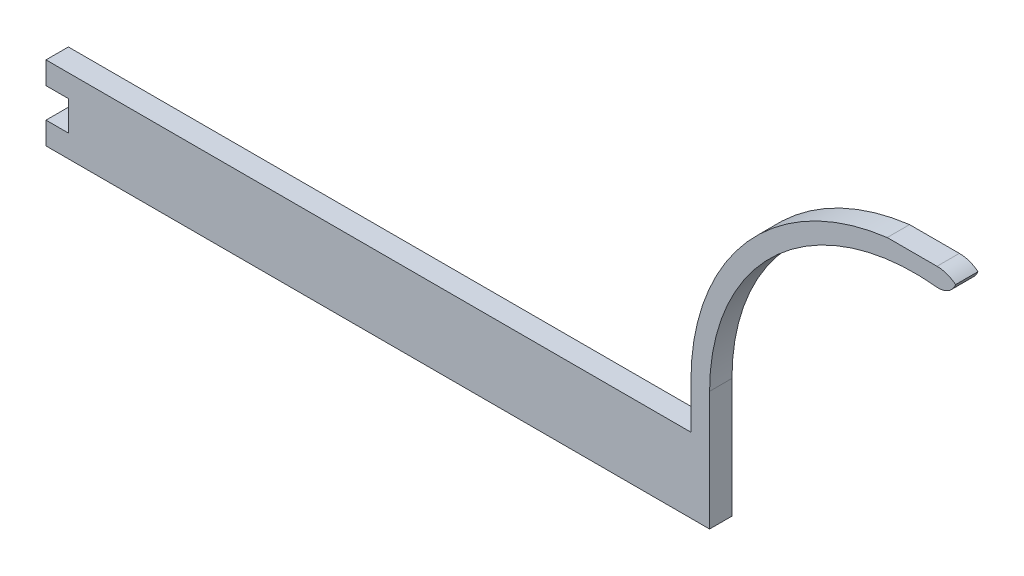
ISO-10303-21;
HEADER;
FILE_DESCRIPTION(('STEP AP214'),'2;1');
FILE_NAME('part.step','',(''),(''),'','','');
FILE_SCHEMA(('AUTOMOTIVE_DESIGN { 1 0 10303 214 1 1 1 1 }'));
ENDSEC;
DATA;
#1=APPLICATION_CONTEXT('core data for automotive mechanical design processes');
#2=APPLICATION_PROTOCOL_DEFINITION('international standard','automotive_design',2000,#1);
#3=PRODUCT_CONTEXT('',#1,'mechanical');
#4=PRODUCT('Part','Part','',(#3));
#5=PRODUCT_RELATED_PRODUCT_CATEGORY('part','',(#4));
#6=PRODUCT_DEFINITION_FORMATION('','',#4);
#7=PRODUCT_DEFINITION_CONTEXT('part definition',#1,'design');
#8=PRODUCT_DEFINITION('design','',#6,#7);
#9=PRODUCT_DEFINITION_SHAPE('','',#8);
#10=(LENGTH_UNIT() NAMED_UNIT(*) SI_UNIT(.MILLI.,.METRE.));
#11=(NAMED_UNIT(*) PLANE_ANGLE_UNIT() SI_UNIT($,.RADIAN.));
#12=(NAMED_UNIT(*) SI_UNIT($,.STERADIAN.) SOLID_ANGLE_UNIT());
#13=UNCERTAINTY_MEASURE_WITH_UNIT(LENGTH_MEASURE(1.E-05),#10,'distance_accuracy_value','');
#14=(GEOMETRIC_REPRESENTATION_CONTEXT(3) GLOBAL_UNCERTAINTY_ASSIGNED_CONTEXT((#13)) GLOBAL_UNIT_ASSIGNED_CONTEXT((#10,
#11,#12)) REPRESENTATION_CONTEXT('',''));
#15=CARTESIAN_POINT('',(0.,0.,0.));
#16=DIRECTION('',(0.,0.,1.));
#17=DIRECTION('',(1.,0.,0.));
#18=AXIS2_PLACEMENT_3D('',#15,#16,#17);
#19=CARTESIAN_POINT('',(172.,0.,6.));
#20=DIRECTION('',(-1.,0.,0.));
#21=DIRECTION('',(0.,0.,1.));
#22=AXIS2_PLACEMENT_3D('',#19,#20,#21);
#23=PLANE('',#22);
#24=DIRECTION('',(0.,1.,0.));
#25=VECTOR('',#24,1.);
#26=CARTESIAN_POINT('',(172.,0.,0.));
#27=LINE('',#26,#25);
#28=CARTESIAN_POINT('',(172.,0.,0.));
#29=VERTEX_POINT('',#28);
#30=CARTESIAN_POINT('',(172.,32.,0.));
#31=VERTEX_POINT('',#30);
#32=EDGE_CURVE('E180',#29,#31,#27,.T.);
#33=ORIENTED_EDGE('',*,*,#32,.T.);
#34=DIRECTION('',(0.,0.,-1.));
#35=VECTOR('',#34,1.);
#36=CARTESIAN_POINT('',(172.,32.,6.));
#37=LINE('',#36,#35);
#38=CARTESIAN_POINT('',(172.,32.,6.));
#39=VERTEX_POINT('',#38);
#40=EDGE_CURVE('E48',#39,#31,#37,.T.);
#41=ORIENTED_EDGE('',*,*,#40,.F.);
#42=DIRECTION('',(0.,1.,0.));
#43=VECTOR('',#42,1.);
#44=CARTESIAN_POINT('',(172.,0.,6.));
#45=LINE('',#44,#43);
#46=CARTESIAN_POINT('',(172.,0.,6.));
#47=VERTEX_POINT('',#46);
#48=EDGE_CURVE('E118',#47,#39,#45,.T.);
#49=ORIENTED_EDGE('',*,*,#48,.F.);
#50=DIRECTION('',(0.,0.,-1.));
#51=VECTOR('',#50,1.);
#52=CARTESIAN_POINT('',(172.,0.,6.));
#53=LINE('',#52,#51);
#54=EDGE_CURVE('E11',#47,#29,#53,.T.);
#55=ORIENTED_EDGE('',*,*,#54,.T.);
#56=EDGE_LOOP('',(#33,#41,#49,#55));
#57=FACE_BOUND('',#56,.T.);
#58=ADVANCED_FACE('F39',(#57),#23,.F.);
#59=CARTESIAN_POINT('',(227.,32.,6.));
#60=DIRECTION('',(0.,0.,-1.));
#61=DIRECTION('',(-1.,0.,0.));
#62=AXIS2_PLACEMENT_3D('',#59,#60,#61);
#63=CYLINDRICAL_SURFACE('',#62,55.);
#64=CARTESIAN_POINT('',(227.,32.,0.));
#65=DIRECTION('',(0.,0.,-1.));
#66=DIRECTION('',(1.,0.,0.));
#67=AXIS2_PLACEMENT_3D('',#64,#65,#66);
#68=CIRCLE('',#67,55.);
#69=CARTESIAN_POINT('',(232.906213145296,86.681959056734,0.));
#70=VERTEX_POINT('',#69);
#71=EDGE_CURVE('E183',#31,#70,#68,.T.);
#72=ORIENTED_EDGE('',*,*,#71,.T.);
#73=DIRECTION('',(0.,0.,-1.));
#74=VECTOR('',#73,1.);
#75=CARTESIAN_POINT('',(232.906213145296,86.681959056734,6.));
#76=LINE('',#75,#74);
#77=CARTESIAN_POINT('',(232.906213145296,86.681959056734,6.));
#78=VERTEX_POINT('',#77);
#79=EDGE_CURVE('E254',#78,#70,#76,.T.);
#80=ORIENTED_EDGE('',*,*,#79,.F.);
#81=CARTESIAN_POINT('',(227.,32.,6.));
#82=DIRECTION('',(0.,0.,-1.));
#83=DIRECTION('',(1.,0.,0.));
#84=AXIS2_PLACEMENT_3D('',#81,#82,#83);
#85=CIRCLE('',#84,55.);
#86=EDGE_CURVE('E264',#39,#78,#85,.T.);
#87=ORIENTED_EDGE('',*,*,#86,.F.);
#88=ORIENTED_EDGE('',*,*,#40,.T.);
#89=EDGE_LOOP('',(#72,#80,#87,#88));
#90=FACE_BOUND('',#89,.T.);
#91=ADVANCED_FACE('F262',(#90),#63,.F.);
#92=CARTESIAN_POINT('',(233.431735039773,91.5474398665704,6.));
#93=DIRECTION('',(0.,0.,-1.));
#94=DIRECTION('',(-1.,0.,0.));
#95=AXIS2_PLACEMENT_3D('',#92,#93,#94);
#96=CYLINDRICAL_SURFACE('',#95,4.89377939556547);
#97=CARTESIAN_POINT('',(233.431735039773,91.5474398665704,0.));
#98=DIRECTION('',(0.,0.,1.));
#99=DIRECTION('',(1.,0.,0.));
#100=AXIS2_PLACEMENT_3D('',#97,#98,#99);
#101=CIRCLE('',#100,4.89377939556547);
#102=CARTESIAN_POINT('',(238.,89.7924378649688,0.));
#103=VERTEX_POINT('',#102);
#104=EDGE_CURVE('E186',#70,#103,#101,.T.);
#105=ORIENTED_EDGE('',*,*,#104,.T.);
#106=DIRECTION('',(0.,0.,-1.));
#107=VECTOR('',#106,1.);
#108=CARTESIAN_POINT('',(238.,89.7924378649688,6.));
#109=LINE('',#108,#107);
#110=CARTESIAN_POINT('',(238.,89.7924378649688,6.));
#111=VERTEX_POINT('',#110);
#112=EDGE_CURVE('E250',#111,#103,#109,.T.);
#113=ORIENTED_EDGE('',*,*,#112,.F.);
#114=CARTESIAN_POINT('',(233.431735039773,91.5474398665704,6.));
#115=DIRECTION('',(0.,0.,1.));
#116=DIRECTION('',(1.,0.,0.));
#117=AXIS2_PLACEMENT_3D('',#114,#115,#116);
#118=CIRCLE('',#117,4.89377939556547);
#119=EDGE_CURVE('E284',#78,#111,#118,.T.);
#120=ORIENTED_EDGE('',*,*,#119,.F.);
#121=ORIENTED_EDGE('',*,*,#79,.T.);
#122=EDGE_LOOP('',(#105,#113,#120,#121));
#123=FACE_BOUND('',#122,.T.);
#124=ADVANCED_FACE('F274',(#123),#96,.T.);
#125=CARTESIAN_POINT('',(233.,83.5474398665704,6.));
#126=DIRECTION('',(0.,0.,-1.));
#127=DIRECTION('',(-1.,0.,0.));
#128=AXIS2_PLACEMENT_3D('',#125,#126,#127);
#129=CYLINDRICAL_SURFACE('',#128,8.00000000000002);
#130=CARTESIAN_POINT('',(233.,83.5474398665704,0.));
#131=DIRECTION('',(0.,0.,1.));
#132=DIRECTION('',(1.,0.,0.));
#133=AXIS2_PLACEMENT_3D('',#130,#131,#132);
#134=CIRCLE('',#133,8.00000000000002);
#135=CARTESIAN_POINT('',(233.,91.5474398665704,0.));
#136=VERTEX_POINT('',#135);
#137=EDGE_CURVE('E189',#103,#136,#134,.T.);
#138=ORIENTED_EDGE('',*,*,#137,.T.);
#139=DIRECTION('',(0.,0.,-1.));
#140=VECTOR('',#139,1.);
#141=CARTESIAN_POINT('',(233.,91.5474398665704,6.));
#142=LINE('',#141,#140);
#143=CARTESIAN_POINT('',(233.,91.5474398665704,6.));
#144=VERTEX_POINT('',#143);
#145=EDGE_CURVE('E246',#144,#136,#142,.T.);
#146=ORIENTED_EDGE('',*,*,#145,.F.);
#147=CARTESIAN_POINT('',(233.,83.5474398665704,6.));
#148=DIRECTION('',(0.,0.,1.));
#149=DIRECTION('',(1.,0.,0.));
#150=AXIS2_PLACEMENT_3D('',#147,#148,#149);
#151=CIRCLE('',#150,8.00000000000002);
#152=EDGE_CURVE('E280',#111,#144,#151,.T.);
#153=ORIENTED_EDGE('',*,*,#152,.F.);
#154=ORIENTED_EDGE('',*,*,#112,.T.);
#155=EDGE_LOOP('',(#138,#146,#153,#154));
#156=FACE_BOUND('',#155,.T.);
#157=ADVANCED_FACE('F278',(#156),#129,.T.);
#158=CARTESIAN_POINT('',(233.,91.5474398665704,6.));
#159=DIRECTION('',(0.,-1.,0.));
#160=DIRECTION('',(0.,0.,-1.));
#161=AXIS2_PLACEMENT_3D('',#158,#159,#160);
#162=PLANE('',#161);
#163=DIRECTION('',(-1.,0.,0.));
#164=VECTOR('',#163,1.);
#165=CARTESIAN_POINT('',(233.,91.5474398665704,0.));
#166=LINE('',#165,#164);
#167=CARTESIAN_POINT('',(219.644566271308,91.5474398665704,0.));
#168=VERTEX_POINT('',#167);
#169=EDGE_CURVE('E192',#136,#168,#166,.T.);
#170=ORIENTED_EDGE('',*,*,#169,.T.);
#171=DIRECTION('',(0.,0.,-1.));
#172=VECTOR('',#171,1.);
#173=CARTESIAN_POINT('',(219.644566271308,91.5474398665704,6.));
#174=LINE('',#173,#172);
#175=CARTESIAN_POINT('',(219.644566271308,91.5474398665704,6.));
#176=VERTEX_POINT('',#175);
#177=EDGE_CURVE('E242',#176,#168,#174,.T.);
#178=ORIENTED_EDGE('',*,*,#177,.F.);
#179=DIRECTION('',(-1.,0.,0.));
#180=VECTOR('',#179,1.);
#181=CARTESIAN_POINT('',(233.,91.5474398665704,6.));
#182=LINE('',#181,#180);
#183=EDGE_CURVE('E283',#144,#176,#182,.T.);
#184=ORIENTED_EDGE('',*,*,#183,.F.);
#185=ORIENTED_EDGE('',*,*,#145,.T.);
#186=EDGE_LOOP('',(#170,#178,#184,#185));
#187=FACE_BOUND('',#186,.T.);
#188=ADVANCED_FACE('F340',(#187),#162,.F.);
#189=CARTESIAN_POINT('',(227.,32.,6.));
#190=DIRECTION('',(0.,0.,-1.));
#191=DIRECTION('',(-1.,0.,0.));
#192=AXIS2_PLACEMENT_3D('',#189,#190,#191);
#193=CYLINDRICAL_SURFACE('',#192,60.);
#194=CARTESIAN_POINT('',(227.,32.,0.));
#195=DIRECTION('',(0.,0.,1.));
#196=DIRECTION('',(1.,0.,0.));
#197=AXIS2_PLACEMENT_3D('',#194,#195,#196);
#198=CIRCLE('',#197,60.);
#199=CARTESIAN_POINT('',(167.,32.,0.));
#200=VERTEX_POINT('',#199);
#201=EDGE_CURVE('E195',#168,#200,#198,.T.);
#202=ORIENTED_EDGE('',*,*,#201,.T.);
#203=DIRECTION('',(0.,0.,-1.));
#204=VECTOR('',#203,1.);
#205=CARTESIAN_POINT('',(167.,32.,6.));
#206=LINE('',#205,#204);
#207=CARTESIAN_POINT('',(167.,32.,6.));
#208=VERTEX_POINT('',#207);
#209=EDGE_CURVE('E238',#208,#200,#206,.T.);
#210=ORIENTED_EDGE('',*,*,#209,.F.);
#211=CARTESIAN_POINT('',(227.,32.,6.));
#212=DIRECTION('',(0.,0.,1.));
#213=DIRECTION('',(1.,0.,0.));
#214=AXIS2_PLACEMENT_3D('',#211,#212,#213);
#215=CIRCLE('',#214,60.);
#216=EDGE_CURVE('E288',#176,#208,#215,.T.);
#217=ORIENTED_EDGE('',*,*,#216,.F.);
#218=ORIENTED_EDGE('',*,*,#177,.T.);
#219=EDGE_LOOP('',(#202,#210,#217,#218));
#220=FACE_BOUND('',#219,.T.);
#221=ADVANCED_FACE('F343',(#220),#193,.T.);
#222=CARTESIAN_POINT('',(167.,32.,6.));
#223=DIRECTION('',(1.,0.,0.));
#224=DIRECTION('',(0.,0.,-1.));
#225=AXIS2_PLACEMENT_3D('',#222,#223,#224);
#226=PLANE('',#225);
#227=DIRECTION('',(0.,-1.,0.));
#228=VECTOR('',#227,1.);
#229=CARTESIAN_POINT('',(167.,32.,0.));
#230=LINE('',#229,#228);
#231=CARTESIAN_POINT('',(167.,20.,0.));
#232=VERTEX_POINT('',#231);
#233=EDGE_CURVE('E198',#200,#232,#230,.T.);
#234=ORIENTED_EDGE('',*,*,#233,.T.);
#235=DIRECTION('',(0.,0.,-1.));
#236=VECTOR('',#235,1.);
#237=CARTESIAN_POINT('',(167.,20.,6.));
#238=LINE('',#237,#236);
#239=CARTESIAN_POINT('',(167.,20.,6.));
#240=VERTEX_POINT('',#239);
#241=EDGE_CURVE('E234',#240,#232,#238,.T.);
#242=ORIENTED_EDGE('',*,*,#241,.F.);
#243=DIRECTION('',(0.,-1.,0.));
#244=VECTOR('',#243,1.);
#245=CARTESIAN_POINT('',(167.,32.,6.));
#246=LINE('',#245,#244);
#247=EDGE_CURVE('E295',#208,#240,#246,.T.);
#248=ORIENTED_EDGE('',*,*,#247,.F.);
#249=ORIENTED_EDGE('',*,*,#209,.T.);
#250=EDGE_LOOP('',(#234,#242,#248,#249));
#251=FACE_BOUND('',#250,.T.);
#252=ADVANCED_FACE('F347',(#251),#226,.F.);
#253=CARTESIAN_POINT('',(0.,20.,6.));
#254=DIRECTION('',(0.,-1.,0.));
#255=DIRECTION('',(0.,0.,-1.));
#256=AXIS2_PLACEMENT_3D('',#253,#254,#255);
#257=PLANE('',#256);
#258=DIRECTION('',(-1.,0.,0.));
#259=VECTOR('',#258,1.);
#260=CARTESIAN_POINT('',(0.,20.,0.));
#261=LINE('',#260,#259);
#262=CARTESIAN_POINT('',(-6.,20.,0.));
#263=VERTEX_POINT('',#262);
#264=EDGE_CURVE('E202',#232,#263,#261,.T.);
#265=ORIENTED_EDGE('',*,*,#264,.T.);
#266=DIRECTION('',(0.,0.,-1.));
#267=VECTOR('',#266,1.);
#268=CARTESIAN_POINT('',(-6.,20.,6.));
#269=LINE('',#268,#267);
#270=CARTESIAN_POINT('',(-6.,20.,6.));
#271=VERTEX_POINT('',#270);
#272=EDGE_CURVE('E230',#271,#263,#269,.T.);
#273=ORIENTED_EDGE('',*,*,#272,.F.);
#274=DIRECTION('',(-1.,0.,0.));
#275=VECTOR('',#274,1.);
#276=CARTESIAN_POINT('',(0.,20.,6.));
#277=LINE('',#276,#275);
#278=EDGE_CURVE('E298',#240,#271,#277,.T.);
#279=ORIENTED_EDGE('',*,*,#278,.F.);
#280=ORIENTED_EDGE('',*,*,#241,.T.);
#281=EDGE_LOOP('',(#265,#273,#279,#280));
#282=FACE_BOUND('',#281,.T.);
#283=ADVANCED_FACE('F351',(#282),#257,.F.);
#284=CARTESIAN_POINT('',(-6.,20.,6.));
#285=DIRECTION('',(1.,0.,0.));
#286=DIRECTION('',(0.,0.,-1.));
#287=AXIS2_PLACEMENT_3D('',#284,#285,#286);
#288=PLANE('',#287);
#289=DIRECTION('',(0.,-1.,0.));
#290=VECTOR('',#289,1.);
#291=CARTESIAN_POINT('',(-6.,20.,0.));
#292=LINE('',#291,#290);
#293=CARTESIAN_POINT('',(-6.,14.,0.));
#294=VERTEX_POINT('',#293);
#295=EDGE_CURVE('E205',#263,#294,#292,.T.);
#296=ORIENTED_EDGE('',*,*,#295,.T.);
#297=DIRECTION('',(0.,0.,-1.));
#298=VECTOR('',#297,1.);
#299=CARTESIAN_POINT('',(-6.,14.,6.));
#300=LINE('',#299,#298);
#301=CARTESIAN_POINT('',(-6.,14.,6.));
#302=VERTEX_POINT('',#301);
#303=EDGE_CURVE('E226',#302,#294,#300,.T.);
#304=ORIENTED_EDGE('',*,*,#303,.F.);
#305=DIRECTION('',(0.,-1.,0.));
#306=VECTOR('',#305,1.);
#307=CARTESIAN_POINT('',(-6.,20.,6.));
#308=LINE('',#307,#306);
#309=EDGE_CURVE('E301',#271,#302,#308,.T.);
#310=ORIENTED_EDGE('',*,*,#309,.F.);
#311=ORIENTED_EDGE('',*,*,#272,.T.);
#312=EDGE_LOOP('',(#296,#304,#310,#311));
#313=FACE_BOUND('',#312,.T.);
#314=ADVANCED_FACE('F309',(#313),#288,.F.);
#315=CARTESIAN_POINT('',(-6.,14.,6.));
#316=DIRECTION('',(0.,1.,0.));
#317=DIRECTION('',(0.,0.,1.));
#318=AXIS2_PLACEMENT_3D('',#315,#316,#317);
#319=PLANE('',#318);
#320=DIRECTION('',(1.,0.,0.));
#321=VECTOR('',#320,1.);
#322=CARTESIAN_POINT('',(-6.,14.,0.));
#323=LINE('',#322,#321);
#324=CARTESIAN_POINT('',(0.,14.,0.));
#325=VERTEX_POINT('',#324);
#326=EDGE_CURVE('E208',#294,#325,#323,.T.);
#327=ORIENTED_EDGE('',*,*,#326,.T.);
#328=DIRECTION('',(0.,0.,-1.));
#329=VECTOR('',#328,1.);
#330=CARTESIAN_POINT('',(0.,14.,6.));
#331=LINE('',#330,#329);
#332=CARTESIAN_POINT('',(0.,14.,6.));
#333=VERTEX_POINT('',#332);
#334=EDGE_CURVE('E167',#333,#325,#331,.T.);
#335=ORIENTED_EDGE('',*,*,#334,.F.);
#336=DIRECTION('',(1.,0.,0.));
#337=VECTOR('',#336,1.);
#338=CARTESIAN_POINT('',(-6.,14.,6.));
#339=LINE('',#338,#337);
#340=EDGE_CURVE('E156',#302,#333,#339,.T.);
#341=ORIENTED_EDGE('',*,*,#340,.F.);
#342=ORIENTED_EDGE('',*,*,#303,.T.);
#343=EDGE_LOOP('',(#327,#335,#341,#342));
#344=FACE_BOUND('',#343,.T.);
#345=ADVANCED_FACE('F313',(#344),#319,.F.);
#346=CARTESIAN_POINT('',(0.,14.,6.));
#347=DIRECTION('',(1.,0.,0.));
#348=DIRECTION('',(0.,1.,0.));
#349=AXIS2_PLACEMENT_3D('',#346,#347,#348);
#350=PLANE('',#349);
#351=DIRECTION('',(0.,-1.,0.));
#352=VECTOR('',#351,1.);
#353=CARTESIAN_POINT('',(0.,14.,0.));
#354=LINE('',#353,#352);
#355=CARTESIAN_POINT('',(0.,6.,0.));
#356=VERTEX_POINT('',#355);
#357=EDGE_CURVE('E165',#325,#356,#354,.T.);
#358=ORIENTED_EDGE('',*,*,#357,.T.);
#359=DIRECTION('',(0.,0.,-1.));
#360=VECTOR('',#359,1.);
#361=CARTESIAN_POINT('',(0.,6.,6.));
#362=LINE('',#361,#360);
#363=CARTESIAN_POINT('',(0.,6.,6.));
#364=VERTEX_POINT('',#363);
#365=EDGE_CURVE('E162',#364,#356,#362,.T.);
#366=ORIENTED_EDGE('',*,*,#365,.F.);
#367=DIRECTION('',(0.,-1.,0.));
#368=VECTOR('',#367,1.);
#369=CARTESIAN_POINT('',(0.,14.,6.));
#370=LINE('',#369,#368);
#371=EDGE_CURVE('E150',#333,#364,#370,.T.);
#372=ORIENTED_EDGE('',*,*,#371,.F.);
#373=ORIENTED_EDGE('',*,*,#334,.T.);
#374=EDGE_LOOP('',(#358,#366,#372,#373));
#375=FACE_BOUND('',#374,.T.);
#376=ADVANCED_FACE('F163',(#375),#350,.F.);
#377=CARTESIAN_POINT('',(0.,6.,6.));
#378=DIRECTION('',(0.,-1.,0.));
#379=DIRECTION('',(0.,0.,-1.));
#380=AXIS2_PLACEMENT_3D('',#377,#378,#379);
#381=PLANE('',#380);
#382=DIRECTION('',(-1.,0.,0.));
#383=VECTOR('',#382,1.);
#384=CARTESIAN_POINT('',(0.,6.,0.));
#385=LINE('',#384,#383);
#386=CARTESIAN_POINT('',(-6.,6.,0.));
#387=VERTEX_POINT('',#386);
#388=EDGE_CURVE('E104',#356,#387,#385,.T.);
#389=ORIENTED_EDGE('',*,*,#388,.T.);
#390=DIRECTION('',(0.,0.,-1.));
#391=VECTOR('',#390,1.);
#392=CARTESIAN_POINT('',(-6.,6.,6.));
#393=LINE('',#392,#391);
#394=CARTESIAN_POINT('',(-6.,6.,6.));
#395=VERTEX_POINT('',#394);
#396=EDGE_CURVE('E168',#395,#387,#393,.T.);
#397=ORIENTED_EDGE('',*,*,#396,.F.);
#398=DIRECTION('',(-1.,0.,0.));
#399=VECTOR('',#398,1.);
#400=CARTESIAN_POINT('',(0.,6.,6.));
#401=LINE('',#400,#399);
#402=EDGE_CURVE('E154',#364,#395,#401,.T.);
#403=ORIENTED_EDGE('',*,*,#402,.F.);
#404=ORIENTED_EDGE('',*,*,#365,.T.);
#405=EDGE_LOOP('',(#389,#397,#403,#404));
#406=FACE_BOUND('',#405,.T.);
#407=ADVANCED_FACE('F170',(#406),#381,.F.);
#408=CARTESIAN_POINT('',(-6.,6.,6.));
#409=DIRECTION('',(1.,0.,0.));
#410=DIRECTION('',(0.,1.,0.));
#411=AXIS2_PLACEMENT_3D('',#408,#409,#410);
#412=PLANE('',#411);
#413=DIRECTION('',(0.,-1.,0.));
#414=VECTOR('',#413,1.);
#415=CARTESIAN_POINT('',(-6.,6.,0.));
#416=LINE('',#415,#414);
#417=CARTESIAN_POINT('',(-6.,0.,0.));
#418=VERTEX_POINT('',#417);
#419=EDGE_CURVE('E111',#387,#418,#416,.T.);
#420=ORIENTED_EDGE('',*,*,#419,.T.);
#421=DIRECTION('',(0.,0.,-1.));
#422=VECTOR('',#421,1.);
#423=CARTESIAN_POINT('',(-6.,0.,6.));
#424=LINE('',#423,#422);
#425=CARTESIAN_POINT('',(-6.,0.,6.));
#426=VERTEX_POINT('',#425);
#427=EDGE_CURVE('E176',#426,#418,#424,.T.);
#428=ORIENTED_EDGE('',*,*,#427,.F.);
#429=DIRECTION('',(0.,-1.,0.));
#430=VECTOR('',#429,1.);
#431=CARTESIAN_POINT('',(-6.,6.,6.));
#432=LINE('',#431,#430);
#433=EDGE_CURVE('E173',#395,#426,#432,.T.);
#434=ORIENTED_EDGE('',*,*,#433,.F.);
#435=ORIENTED_EDGE('',*,*,#396,.T.);
#436=EDGE_LOOP('',(#420,#428,#434,#435));
#437=FACE_BOUND('',#436,.T.);
#438=ADVANCED_FACE('F315',(#437),#412,.F.);
#439=CARTESIAN_POINT('',(-6.,0.,6.));
#440=DIRECTION('',(0.,1.,0.));
#441=DIRECTION('',(0.,0.,1.));
#442=AXIS2_PLACEMENT_3D('',#439,#440,#441);
#443=PLANE('',#442);
#444=DIRECTION('',(1.,0.,0.));
#445=VECTOR('',#444,1.);
#446=CARTESIAN_POINT('',(-6.,0.,0.));
#447=LINE('',#446,#445);
#448=EDGE_CURVE('E217',#418,#29,#447,.T.);
#449=ORIENTED_EDGE('',*,*,#448,.T.);
#450=ORIENTED_EDGE('',*,*,#54,.F.);
#451=DIRECTION('',(1.,0.,0.));
#452=VECTOR('',#451,1.);
#453=CARTESIAN_POINT('',(0.,0.,6.));
#454=LINE('',#453,#452);
#455=EDGE_CURVE('E56',#426,#47,#454,.T.);
#456=ORIENTED_EDGE('',*,*,#455,.F.);
#457=ORIENTED_EDGE('',*,*,#427,.T.);
#458=EDGE_LOOP('',(#449,#450,#456,#457));
#459=FACE_BOUND('',#458,.T.);
#460=ADVANCED_FACE('F314',(#459),#443,.F.);
#461=CARTESIAN_POINT('',(227.,32.,6.));
#462=DIRECTION('',(0.,0.,1.));
#463=DIRECTION('',(1.,0.,0.));
#464=AXIS2_PLACEMENT_3D('',#461,#462,#463);
#465=PLANE('',#464);
#466=ORIENTED_EDGE('',*,*,#455,.T.);
#467=ORIENTED_EDGE('',*,*,#48,.T.);
#468=ORIENTED_EDGE('',*,*,#86,.T.);
#469=ORIENTED_EDGE('',*,*,#119,.T.);
#470=ORIENTED_EDGE('',*,*,#152,.T.);
#471=ORIENTED_EDGE('',*,*,#183,.T.);
#472=ORIENTED_EDGE('',*,*,#216,.T.);
#473=ORIENTED_EDGE('',*,*,#247,.T.);
#474=ORIENTED_EDGE('',*,*,#278,.T.);
#475=ORIENTED_EDGE('',*,*,#309,.T.);
#476=ORIENTED_EDGE('',*,*,#340,.T.);
#477=ORIENTED_EDGE('',*,*,#371,.T.);
#478=ORIENTED_EDGE('',*,*,#402,.T.);
#479=ORIENTED_EDGE('',*,*,#433,.T.);
#480=EDGE_LOOP('',(#466,#467,#468,#469,#470,#471,#472,#473,#474,#475,#476,#477,#478,#479));
#481=FACE_BOUND('',#480,.T.);
#482=ADVANCED_FACE('F152',(#481),#465,.T.);
#483=CARTESIAN_POINT('',(227.,32.,0.));
#484=DIRECTION('',(0.,0.,1.));
#485=DIRECTION('',(1.,0.,0.));
#486=AXIS2_PLACEMENT_3D('',#483,#484,#485);
#487=PLANE('',#486);
#488=ORIENTED_EDGE('',*,*,#32,.F.);
#489=ORIENTED_EDGE('',*,*,#448,.F.);
#490=ORIENTED_EDGE('',*,*,#419,.F.);
#491=ORIENTED_EDGE('',*,*,#388,.F.);
#492=ORIENTED_EDGE('',*,*,#357,.F.);
#493=ORIENTED_EDGE('',*,*,#326,.F.);
#494=ORIENTED_EDGE('',*,*,#295,.F.);
#495=ORIENTED_EDGE('',*,*,#264,.F.);
#496=ORIENTED_EDGE('',*,*,#233,.F.);
#497=ORIENTED_EDGE('',*,*,#201,.F.);
#498=ORIENTED_EDGE('',*,*,#169,.F.);
#499=ORIENTED_EDGE('',*,*,#137,.F.);
#500=ORIENTED_EDGE('',*,*,#104,.F.);
#501=ORIENTED_EDGE('',*,*,#71,.F.);
#502=EDGE_LOOP('',(#488,#489,#490,#491,#492,#493,#494,#495,#496,#497,#498,#499,#500,#501));
#503=FACE_BOUND('',#502,.T.);
#504=ADVANCED_FACE('F268',(#503),#487,.F.);
#505=CLOSED_SHELL('',(#58,#91,#124,#157,#188,#221,#252,#283,#314,#345,#376,#407,#438,#460,#482,#504));
#506=MANIFOLD_SOLID_BREP('B2',#505);
#507=ADVANCED_BREP_SHAPE_REPRESENTATION('',(#18,#506),#14);
#508=SHAPE_DEFINITION_REPRESENTATION(#9,#507);
ENDSEC;
END-ISO-10303-21;
